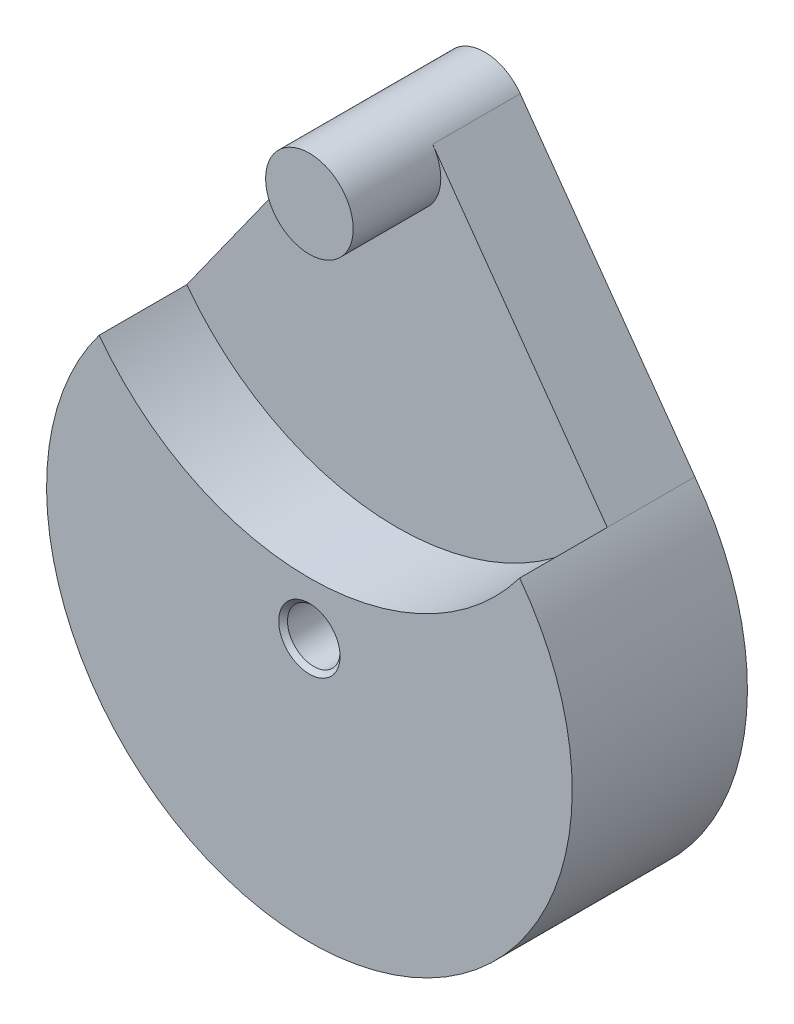
ISO-10303-21;
HEADER;
FILE_DESCRIPTION(('STEP AP214'),'2;1');
FILE_NAME('part.step','',(''),(''),'','','');
FILE_SCHEMA(('AUTOMOTIVE_DESIGN { 1 0 10303 214 1 1 1 1 }'));
ENDSEC;
DATA;
#1=APPLICATION_CONTEXT('core data for automotive mechanical design processes');
#2=APPLICATION_PROTOCOL_DEFINITION('international standard','automotive_design',2000,#1);
#3=PRODUCT_CONTEXT('',#1,'mechanical');
#4=PRODUCT('Part','Part','',(#3));
#5=PRODUCT_RELATED_PRODUCT_CATEGORY('part','',(#4));
#6=PRODUCT_DEFINITION_FORMATION('','',#4);
#7=PRODUCT_DEFINITION_CONTEXT('part definition',#1,'design');
#8=PRODUCT_DEFINITION('design','',#6,#7);
#9=PRODUCT_DEFINITION_SHAPE('','',#8);
#10=(LENGTH_UNIT() NAMED_UNIT(*) SI_UNIT(.MILLI.,.METRE.));
#11=(NAMED_UNIT(*) PLANE_ANGLE_UNIT() SI_UNIT($,.RADIAN.));
#12=(NAMED_UNIT(*) SI_UNIT($,.STERADIAN.) SOLID_ANGLE_UNIT());
#13=UNCERTAINTY_MEASURE_WITH_UNIT(LENGTH_MEASURE(1.E-05),#10,'distance_accuracy_value','');
#14=(GEOMETRIC_REPRESENTATION_CONTEXT(3) GLOBAL_UNCERTAINTY_ASSIGNED_CONTEXT((#13)) GLOBAL_UNIT_ASSIGNED_CONTEXT((#10,
#11,#12)) REPRESENTATION_CONTEXT('',''));
#15=CARTESIAN_POINT('',(0.,0.,0.));
#16=DIRECTION('',(0.,0.,1.));
#17=DIRECTION('',(1.,0.,0.));
#18=AXIS2_PLACEMENT_3D('',#15,#16,#17);
#19=CARTESIAN_POINT('',(0.,0.,10.));
#20=DIRECTION('',(0.,0.,1.));
#21=DIRECTION('',(1.,0.,0.));
#22=AXIS2_PLACEMENT_3D('',#19,#20,#21);
#23=PLANE('',#22);
#24=DIRECTION('',(0.581206122876929,-0.813756377996737,0.));
#25=VECTOR('',#24,1.);
#26=CARTESIAN_POINT('',(24.4060700351222,17.4314545769779,10.));
#27=LINE('',#26,#25);
#28=CARTESIAN_POINT('',(4.06878188998244,45.9060306143838,10.));
#29=VERTEX_POINT('',#28);
#30=CARTESIAN_POINT('',(24.,18.,10.));
#31=VERTEX_POINT('',#30);
#32=EDGE_CURVE('E78',#29,#31,#27,.T.);
#33=ORIENTED_EDGE('',*,*,#32,.F.);
#34=CARTESIAN_POINT('',(0.,43.,10.));
#35=DIRECTION('',(0.,0.,1.));
#36=DIRECTION('',(1.,0.,0.));
#37=AXIS2_PLACEMENT_3D('',#34,#35,#36);
#38=CIRCLE('',#37,5.);
#39=CARTESIAN_POINT('',(-4.06878188998355,45.9060306143848,10.));
#40=VERTEX_POINT('',#39);
#41=EDGE_CURVE('E119',#40,#29,#38,.T.);
#42=ORIENTED_EDGE('',*,*,#41,.F.);
#43=DIRECTION('',(-0.581206122876966,-0.81375637799671,0.));
#44=VECTOR('',#43,1.);
#45=CARTESIAN_POINT('',(-24.4060700351215,17.4314545769791,10.));
#46=LINE('',#45,#44);
#47=CARTESIAN_POINT('',(-24.,18.,10.));
#48=VERTEX_POINT('',#47);
#49=EDGE_CURVE('E112',#40,#48,#46,.T.);
#50=ORIENTED_EDGE('',*,*,#49,.T.);
#51=CARTESIAN_POINT('',(0.,36.,10.));
#52=DIRECTION('',(0.,0.,-1.));
#53=DIRECTION('',(1.,0.,0.));
#54=AXIS2_PLACEMENT_3D('',#51,#52,#53);
#55=CIRCLE('',#54,30.);
#56=EDGE_CURVE('E105',#31,#48,#55,.T.);
#57=ORIENTED_EDGE('',*,*,#56,.F.);
#58=EDGE_LOOP('',(#33,#42,#50,#57));
#59=FACE_BOUND('',#58,.T.);
#60=ADVANCED_FACE('F32',(#59),#23,.T.);
#61=CARTESIAN_POINT('',(0.,0.,0.));
#62=DIRECTION('',(0.,0.,1.));
#63=DIRECTION('',(1.,0.,0.));
#64=AXIS2_PLACEMENT_3D('',#61,#62,#63);
#65=PLANE('',#64);
#66=CARTESIAN_POINT('',(0.,0.,0.));
#67=DIRECTION('',(0.,0.,1.));
#68=DIRECTION('',(1.,0.,0.));
#69=AXIS2_PLACEMENT_3D('',#66,#67,#68);
#70=CIRCLE('',#69,3.50000000000002);
#71=CARTESIAN_POINT('',(-3.50000000000002,0.,0.));
#72=VERTEX_POINT('',#71);
#73=EDGE_CURVE('E123',#72,#72,#70,.T.);
#74=ORIENTED_EDGE('',*,*,#73,.T.);
#75=EDGE_LOOP('',(#74));
#76=FACE_BOUND('',#75,.T.);
#77=CARTESIAN_POINT('',(0.,43.,0.));
#78=DIRECTION('',(0.,0.,1.));
#79=DIRECTION('',(1.,0.,0.));
#80=AXIS2_PLACEMENT_3D('',#77,#78,#79);
#81=CIRCLE('',#80,5.);
#82=CARTESIAN_POINT('',(4.06878188998368,45.9060306143846,0.));
#83=VERTEX_POINT('',#82);
#84=CARTESIAN_POINT('',(-4.06878188998101,45.906030614383,0.));
#85=VERTEX_POINT('',#84);
#86=EDGE_CURVE('E86',#83,#85,#81,.T.);
#87=ORIENTED_EDGE('',*,*,#86,.F.);
#88=DIRECTION('',(0.581206122876929,-0.813756377996737,0.));
#89=VECTOR('',#88,1.);
#90=CARTESIAN_POINT('',(24.4060700351222,17.4314545769779,0.));
#91=LINE('',#90,#89);
#92=CARTESIAN_POINT('',(24.,18.,0.));
#93=VERTEX_POINT('',#92);
#94=EDGE_CURVE('E87',#83,#93,#91,.T.);
#95=ORIENTED_EDGE('',*,*,#94,.T.);
#96=CARTESIAN_POINT('',(0.,0.,0.));
#97=DIRECTION('',(0.,0.,1.));
#98=DIRECTION('',(1.,0.,0.));
#99=AXIS2_PLACEMENT_3D('',#96,#97,#98);
#100=CIRCLE('',#99,30.);
#101=CARTESIAN_POINT('',(-24.,18.,0.));
#102=VERTEX_POINT('',#101);
#103=EDGE_CURVE('E98',#102,#93,#100,.T.);
#104=ORIENTED_EDGE('',*,*,#103,.F.);
#105=DIRECTION('',(-0.581206122876966,-0.81375637799671,0.));
#106=VECTOR('',#105,1.);
#107=CARTESIAN_POINT('',(-24.4060700351215,17.4314545769791,0.));
#108=LINE('',#107,#106);
#109=EDGE_CURVE('E148',#85,#102,#108,.T.);
#110=ORIENTED_EDGE('',*,*,#109,.F.);
#111=EDGE_LOOP('',(#87,#95,#104,#110));
#112=FACE_BOUND('',#111,.T.);
#113=ADVANCED_FACE('F141',(#76,#112),#65,.F.);
#114=CARTESIAN_POINT('',(0.,43.,20.));
#115=DIRECTION('',(0.,0.,-1.));
#116=DIRECTION('',(-1.,0.,0.));
#117=AXIS2_PLACEMENT_3D('',#114,#115,#116);
#118=CYLINDRICAL_SURFACE('',#117,5.);
#119=ORIENTED_EDGE('',*,*,#41,.T.);
#120=DIRECTION('',(0.,0.,-1.));
#121=VECTOR('',#120,1.);
#122=CARTESIAN_POINT('',(4.06878188998244,45.9060306143838,20.));
#123=LINE('',#122,#121);
#124=EDGE_CURVE('E47',#29,#83,#123,.T.);
#125=ORIENTED_EDGE('',*,*,#124,.T.);
#126=ORIENTED_EDGE('',*,*,#86,.T.);
#127=DIRECTION('',(0.,0.,-1.));
#128=VECTOR('',#127,1.);
#129=CARTESIAN_POINT('',(-4.06878188998101,45.906030614383,20.));
#130=LINE('',#129,#128);
#131=EDGE_CURVE('E52',#40,#85,#130,.T.);
#132=ORIENTED_EDGE('',*,*,#131,.F.);
#133=EDGE_LOOP('',(#119,#125,#126,#132));
#134=FACE_BOUND('',#133,.T.);
#135=CARTESIAN_POINT('',(0.,43.,20.));
#136=DIRECTION('',(0.,0.,1.));
#137=DIRECTION('',(1.,0.,0.));
#138=AXIS2_PLACEMENT_3D('',#135,#136,#137);
#139=CIRCLE('',#138,5.);
#140=CARTESIAN_POINT('',(5.,43.,20.));
#141=VERTEX_POINT('',#140);
#142=EDGE_CURVE('E120',#141,#141,#139,.T.);
#143=ORIENTED_EDGE('',*,*,#142,.F.);
#144=EDGE_LOOP('',(#143));
#145=FACE_BOUND('',#144,.T.);
#146=ADVANCED_FACE('F144',(#134,#145),#118,.T.);
#147=CARTESIAN_POINT('',(0.,43.,20.));
#148=DIRECTION('',(0.,0.,1.));
#149=DIRECTION('',(1.,0.,0.));
#150=AXIS2_PLACEMENT_3D('',#147,#148,#149);
#151=PLANE('',#150);
#152=ORIENTED_EDGE('',*,*,#142,.T.);
#153=EDGE_LOOP('',(#152));
#154=FACE_BOUND('',#153,.T.);
#155=ADVANCED_FACE('F176',(#154),#151,.T.);
#156=CARTESIAN_POINT('',(0.,36.,20.));
#157=DIRECTION('',(0.,0.,-1.));
#158=DIRECTION('',(-1.,0.,0.));
#159=AXIS2_PLACEMENT_3D('',#156,#157,#158);
#160=CYLINDRICAL_SURFACE('',#159,30.);
#161=ORIENTED_EDGE('',*,*,#56,.T.);
#162=DIRECTION('',(0.,0.,-1.));
#163=VECTOR('',#162,1.);
#164=CARTESIAN_POINT('',(-24.,18.,20.));
#165=LINE('',#164,#163);
#166=CARTESIAN_POINT('',(-24.,18.,20.));
#167=VERTEX_POINT('',#166);
#168=EDGE_CURVE('E108',#167,#48,#165,.T.);
#169=ORIENTED_EDGE('',*,*,#168,.F.);
#170=CARTESIAN_POINT('',(0.,36.,20.));
#171=DIRECTION('',(0.,0.,-1.));
#172=DIRECTION('',(1.,0.,0.));
#173=AXIS2_PLACEMENT_3D('',#170,#171,#172);
#174=CIRCLE('',#173,30.);
#175=CARTESIAN_POINT('',(24.,18.,20.));
#176=VERTEX_POINT('',#175);
#177=EDGE_CURVE('E107',#176,#167,#174,.T.);
#178=ORIENTED_EDGE('',*,*,#177,.F.);
#179=DIRECTION('',(0.,0.,-1.));
#180=VECTOR('',#179,1.);
#181=CARTESIAN_POINT('',(24.,18.,20.));
#182=LINE('',#181,#180);
#183=EDGE_CURVE('E94',#176,#31,#182,.T.);
#184=ORIENTED_EDGE('',*,*,#183,.T.);
#185=EDGE_LOOP('',(#161,#169,#178,#184));
#186=FACE_BOUND('',#185,.T.);
#187=ADVANCED_FACE('F103',(#186),#160,.F.);
#188=CARTESIAN_POINT('',(0.,0.,20.));
#189=DIRECTION('',(0.,0.,-1.));
#190=DIRECTION('',(-1.,0.,0.));
#191=AXIS2_PLACEMENT_3D('',#188,#189,#190);
#192=CYLINDRICAL_SURFACE('',#191,30.);
#193=ORIENTED_EDGE('',*,*,#168,.T.);
#194=DIRECTION('',(0.,0.,-1.));
#195=VECTOR('',#194,1.);
#196=CARTESIAN_POINT('',(-24.,18.,20.));
#197=LINE('',#196,#195);
#198=EDGE_CURVE('E99',#48,#102,#197,.T.);
#199=ORIENTED_EDGE('',*,*,#198,.T.);
#200=ORIENTED_EDGE('',*,*,#103,.T.);
#201=DIRECTION('',(0.,0.,-1.));
#202=VECTOR('',#201,1.);
#203=CARTESIAN_POINT('',(24.,18.,20.));
#204=LINE('',#203,#202);
#205=EDGE_CURVE('E81',#31,#93,#204,.T.);
#206=ORIENTED_EDGE('',*,*,#205,.F.);
#207=ORIENTED_EDGE('',*,*,#183,.F.);
#208=CARTESIAN_POINT('',(0.,0.,20.));
#209=DIRECTION('',(0.,0.,1.));
#210=DIRECTION('',(1.,0.,0.));
#211=AXIS2_PLACEMENT_3D('',#208,#209,#210);
#212=CIRCLE('',#211,30.);
#213=EDGE_CURVE('E109',#167,#176,#212,.T.);
#214=ORIENTED_EDGE('',*,*,#213,.F.);
#215=EDGE_LOOP('',(#193,#199,#200,#206,#207,#214));
#216=FACE_BOUND('',#215,.T.);
#217=ADVANCED_FACE('F93',(#216),#192,.T.);
#218=CARTESIAN_POINT('',(0.,18.,20.));
#219=DIRECTION('',(0.,0.,1.));
#220=DIRECTION('',(1.,0.,0.));
#221=AXIS2_PLACEMENT_3D('',#218,#219,#220);
#222=PLANE('',#221);
#223=CARTESIAN_POINT('',(0.,0.,20.));
#224=DIRECTION('',(0.,0.,1.));
#225=DIRECTION('',(1.,0.,0.));
#226=AXIS2_PLACEMENT_3D('',#223,#224,#225);
#227=CIRCLE('',#226,3.50000000000002);
#228=CARTESIAN_POINT('',(3.50000000000002,0.,20.));
#229=VERTEX_POINT('',#228);
#230=EDGE_CURVE('E11',#229,#229,#227,.F.);
#231=ORIENTED_EDGE('',*,*,#230,.T.);
#232=EDGE_LOOP('',(#231));
#233=FACE_BOUND('',#232,.T.);
#234=ORIENTED_EDGE('',*,*,#177,.T.);
#235=ORIENTED_EDGE('',*,*,#213,.T.);
#236=EDGE_LOOP('',(#234,#235));
#237=FACE_BOUND('',#236,.T.);
#238=ADVANCED_FACE('F159',(#233,#237),#222,.T.);
#239=CARTESIAN_POINT('',(0.,0.,0.));
#240=DIRECTION('',(0.,0.,1.));
#241=DIRECTION('',(1.,0.,0.));
#242=AXIS2_PLACEMENT_3D('',#239,#240,#241);
#243=CYLINDRICAL_SURFACE('',#242,3.);
#244=CARTESIAN_POINT('',(0.,0.,0.50000000000002));
#245=DIRECTION('',(0.,0.,1.));
#246=DIRECTION('',(1.,0.,0.));
#247=AXIS2_PLACEMENT_3D('',#244,#245,#246);
#248=CIRCLE('',#247,3.);
#249=CARTESIAN_POINT('',(-3.,0.,0.50000000000002));
#250=VERTEX_POINT('',#249);
#251=EDGE_CURVE('E40',#250,#250,#248,.F.);
#252=ORIENTED_EDGE('',*,*,#251,.T.);
#253=EDGE_LOOP('',(#252));
#254=FACE_BOUND('',#253,.T.);
#255=CARTESIAN_POINT('',(0.,0.,19.5));
#256=DIRECTION('',(0.,0.,1.));
#257=DIRECTION('',(1.,0.,0.));
#258=AXIS2_PLACEMENT_3D('',#255,#256,#257);
#259=CIRCLE('',#258,3.);
#260=CARTESIAN_POINT('',(3.,0.,19.5));
#261=VERTEX_POINT('',#260);
#262=EDGE_CURVE('E127',#261,#261,#259,.T.);
#263=ORIENTED_EDGE('',*,*,#262,.T.);
#264=EDGE_LOOP('',(#263));
#265=FACE_BOUND('',#264,.T.);
#266=ADVANCED_FACE('F132',(#254,#265),#243,.F.);
#267=CARTESIAN_POINT('',(24.4060700351222,17.4314545769779,20.));
#268=DIRECTION('',(-0.813756377996737,-0.581206122876929,0.));
#269=DIRECTION('',(0.581206122876929,-0.813756377996737,0.));
#270=AXIS2_PLACEMENT_3D('',#267,#268,#269);
#271=PLANE('',#270);
#272=ORIENTED_EDGE('',*,*,#32,.T.);
#273=ORIENTED_EDGE('',*,*,#205,.T.);
#274=ORIENTED_EDGE('',*,*,#94,.F.);
#275=ORIENTED_EDGE('',*,*,#124,.F.);
#276=EDGE_LOOP('',(#272,#273,#274,#275));
#277=FACE_BOUND('',#276,.T.);
#278=ADVANCED_FACE('F80',(#277),#271,.F.);
#279=CARTESIAN_POINT('',(-24.4060700351215,17.4314545769791,20.));
#280=DIRECTION('',(-0.81375637799671,0.581206122876966,0.));
#281=DIRECTION('',(-0.581206122876966,-0.81375637799671,0.));
#282=AXIS2_PLACEMENT_3D('',#279,#280,#281);
#283=PLANE('',#282);
#284=ORIENTED_EDGE('',*,*,#131,.T.);
#285=ORIENTED_EDGE('',*,*,#109,.T.);
#286=ORIENTED_EDGE('',*,*,#198,.F.);
#287=ORIENTED_EDGE('',*,*,#49,.F.);
#288=EDGE_LOOP('',(#284,#285,#286,#287));
#289=FACE_BOUND('',#288,.T.);
#290=ADVANCED_FACE('F138',(#289),#283,.T.);
#291=CARTESIAN_POINT('',(0.,0.,0.));
#292=DIRECTION('',(0.,0.,-1.));
#293=DIRECTION('',(-1.,0.,0.));
#294=AXIS2_PLACEMENT_3D('',#291,#292,#293);
#295=CONICAL_SURFACE('',#294,3.50000000000002,0.785398163397445);
#296=CARTESIAN_POINT('',(-3.,0.,0.50000000000002));
#297=CARTESIAN_POINT('',(-3.00520833333333,0.,0.494791666666686));
#298=CARTESIAN_POINT('',(-3.01041666666667,0.,0.489583333333353));
#299=CARTESIAN_POINT('',(-3.02083333333333,0.,0.479166666666686));
#300=CARTESIAN_POINT('',(-3.02604166666667,0.,0.473958333333352));
#301=CARTESIAN_POINT('',(-3.03645833333333,0.,0.463541666666685));
#302=CARTESIAN_POINT('',(-3.04166666666667,0.,0.458333333333351));
#303=CARTESIAN_POINT('',(-3.05208333333334,0.,0.447916666666684));
#304=CARTESIAN_POINT('',(-3.05729166666667,0.,0.442708333333351));
#305=CARTESIAN_POINT('',(-3.06770833333334,0.,0.432291666666684));
#306=CARTESIAN_POINT('',(-3.07291666666667,0.,0.42708333333335));
#307=CARTESIAN_POINT('',(-3.08333333333334,0.,0.416666666666683));
#308=CARTESIAN_POINT('',(-3.08854166666667,0.,0.41145833333335));
#309=CARTESIAN_POINT('',(-3.09895833333334,0.,0.401041666666683));
#310=CARTESIAN_POINT('',(-3.10416666666667,0.,0.395833333333349));
#311=CARTESIAN_POINT('',(-3.11458333333334,0.,0.385416666666682));
#312=CARTESIAN_POINT('',(-3.11979166666667,0.,0.380208333333348));
#313=CARTESIAN_POINT('',(-3.13020833333334,0.,0.369791666666681));
#314=CARTESIAN_POINT('',(-3.13541666666667,0.,0.364583333333348));
#315=CARTESIAN_POINT('',(-3.14583333333334,0.,0.354166666666681));
#316=CARTESIAN_POINT('',(-3.15104166666667,0.,0.348958333333347));
#317=CARTESIAN_POINT('',(-3.16145833333334,0.,0.33854166666668));
#318=CARTESIAN_POINT('',(-3.16666666666667,0.,0.333333333333346));
#319=CARTESIAN_POINT('',(-3.17708333333334,0.,0.322916666666679));
#320=CARTESIAN_POINT('',(-3.18229166666667,0.,0.317708333333346));
#321=CARTESIAN_POINT('',(-3.19270833333334,0.,0.307291666666679));
#322=CARTESIAN_POINT('',(-3.19791666666667,0.,0.302083333333345));
#323=CARTESIAN_POINT('',(-3.20833333333334,0.,0.291666666666678));
#324=CARTESIAN_POINT('',(-3.21354166666667,0.,0.286458333333345));
#325=CARTESIAN_POINT('',(-3.22395833333334,0.,0.276041666666678));
#326=CARTESIAN_POINT('',(-3.22916666666667,0.,0.270833333333344));
#327=CARTESIAN_POINT('',(-3.23958333333334,0.,0.260416666666677));
#328=CARTESIAN_POINT('',(-3.24479166666667,0.,0.255208333333343));
#329=CARTESIAN_POINT('',(-3.25520833333334,0.,0.244791666666676));
#330=CARTESIAN_POINT('',(-3.26041666666668,0.,0.239583333333343));
#331=CARTESIAN_POINT('',(-3.27083333333334,0.,0.229166666666676));
#332=CARTESIAN_POINT('',(-3.27604166666668,0.,0.223958333333342));
#333=CARTESIAN_POINT('',(-3.28645833333334,0.,0.213541666666675));
#334=CARTESIAN_POINT('',(-3.29166666666668,0.,0.208333333333342));
#335=CARTESIAN_POINT('',(-3.30208333333334,0.,0.197916666666674));
#336=CARTESIAN_POINT('',(-3.30729166666668,0.,0.192708333333341));
#337=CARTESIAN_POINT('',(-3.31770833333334,0.,0.182291666666674));
#338=CARTESIAN_POINT('',(-3.32291666666668,0.,0.17708333333334));
#339=CARTESIAN_POINT('',(-3.33333333333335,0.,0.166666666666673));
#340=CARTESIAN_POINT('',(-3.33854166666668,0.,0.16145833333334));
#341=CARTESIAN_POINT('',(-3.34895833333335,0.,0.151041666666673));
#342=CARTESIAN_POINT('',(-3.35416666666668,0.,0.145833333333339));
#343=CARTESIAN_POINT('',(-3.36458333333335,0.,0.135416666666672));
#344=CARTESIAN_POINT('',(-3.36979166666668,0.,0.130208333333338));
#345=CARTESIAN_POINT('',(-3.38020833333335,0.,0.119791666666671));
#346=CARTESIAN_POINT('',(-3.38541666666668,0.,0.114583333333338));
#347=CARTESIAN_POINT('',(-3.39583333333335,0.,0.104166666666671));
#348=CARTESIAN_POINT('',(-3.40104166666668,0.,0.0989583333333372));
#349=CARTESIAN_POINT('',(-3.41145833333335,0.,0.0885416666666702));
#350=CARTESIAN_POINT('',(-3.41666666666668,0.,0.0833333333333366));
#351=CARTESIAN_POINT('',(-3.42708333333335,0.,0.0729166666666695));
#352=CARTESIAN_POINT('',(-3.43229166666668,0.,0.0677083333333359));
#353=CARTESIAN_POINT('',(-3.44270833333335,0.,0.0572916666666689));
#354=CARTESIAN_POINT('',(-3.44791666666668,0.,0.0520833333333354));
#355=CARTESIAN_POINT('',(-3.45833333333335,0.,0.0416666666666683));
#356=CARTESIAN_POINT('',(-3.46354166666668,0.,0.0364583333333348));
#357=CARTESIAN_POINT('',(-3.47395833333335,0.,0.0260416666666677));
#358=CARTESIAN_POINT('',(-3.47916666666668,0.,0.0208333333333341));
#359=CARTESIAN_POINT('',(-3.48958333333335,0.,0.0104166666666671));
#360=CARTESIAN_POINT('',(-3.49479166666668,0.,0.00520833333333355));
#361=CARTESIAN_POINT('',(-3.50000000000002,0.,0.));
#362=B_SPLINE_CURVE_WITH_KNOTS('',3,(#296,#297,#298,#299,#300,#301,#302,#303,#304,#305,#306,
#307,#308,#309,#310,#311,#312,#313,#314,#315,#316,#317,#318,#319,#320,#321,#322,#323,#324,#325,
#326,#327,#328,#329,#330,#331,#332,#333,#334,#335,#336,#337,#338,#339,#340,#341,#342,#343,#344,
#345,#346,#347,#348,#349,#350,#351,#352,#353,#354,#355,#356,#357,#358,#359,#360,#361),
.UNSPECIFIED.,.F.,.F.,(4,2,2,2,2,2,2,2,2,2,2,2,2,2,2,2,2,2,2,2,2,2,2,2,2,2,2,2,2,2,2,2,4),(0.,
0.0220970869120806,0.044194173824161,0.0662912607362414,0.0883883476483217,0.110485434560402,
0.132582521472483,0.154679608384563,0.176776695296643,0.198873782208724,0.220970869120804,
0.243067956032885,0.265165042944965,0.287262129857046,0.309359216769126,0.331456303681206,
0.353553390593287,0.375650477505367,0.397747564417448,0.419844651329528,0.441941738241608,
0.464038825153689,0.486135912065769,0.50823299897785,0.53033008588993,0.55242717280201,
0.574524259714091,0.596621346626171,0.618718433538252,0.640815520450332,0.662912607362413,
0.685009694274493,0.707106781186574),.UNSPECIFIED.);
#363=EDGE_CURVE('BSEAM135',#250,#72,#362,.T.);
#364=ORIENTED_EDGE('',*,*,#251,.F.);
#365=ORIENTED_EDGE('',*,*,#73,.F.);
#366=ORIENTED_EDGE('',*,*,#363,.T.);
#367=ORIENTED_EDGE('',*,*,#363,.F.);
#368=EDGE_LOOP('',(#364,#366,#365,#367));
#369=FACE_BOUND('',#368,.T.);
#370=ADVANCED_FACE('F135',(#369),#295,.F.);
#371=CARTESIAN_POINT('',(0.,0.,19.5));
#372=DIRECTION('',(0.,0.,1.));
#373=DIRECTION('',(1.,0.,0.));
#374=AXIS2_PLACEMENT_3D('',#371,#372,#373);
#375=CONICAL_SURFACE('',#374,3.,0.785398163397458);
#376=ORIENTED_EDGE('',*,*,#230,.F.);
#377=EDGE_LOOP('',(#376));
#378=FACE_BOUND('',#377,.T.);
#379=ORIENTED_EDGE('',*,*,#262,.F.);
#380=EDGE_LOOP('',(#379));
#381=FACE_BOUND('',#380,.T.);
#382=ADVANCED_FACE('F34',(#378,#381),#375,.F.);
#383=CLOSED_SHELL('',(#60,#113,#146,#155,#187,#217,#238,#266,#278,#290,#370,#382));
#384=MANIFOLD_SOLID_BREP('B2',#383);
#385=ADVANCED_BREP_SHAPE_REPRESENTATION('',(#18,#384),#14);
#386=SHAPE_DEFINITION_REPRESENTATION(#9,#385);
ENDSEC;
END-ISO-10303-21;
